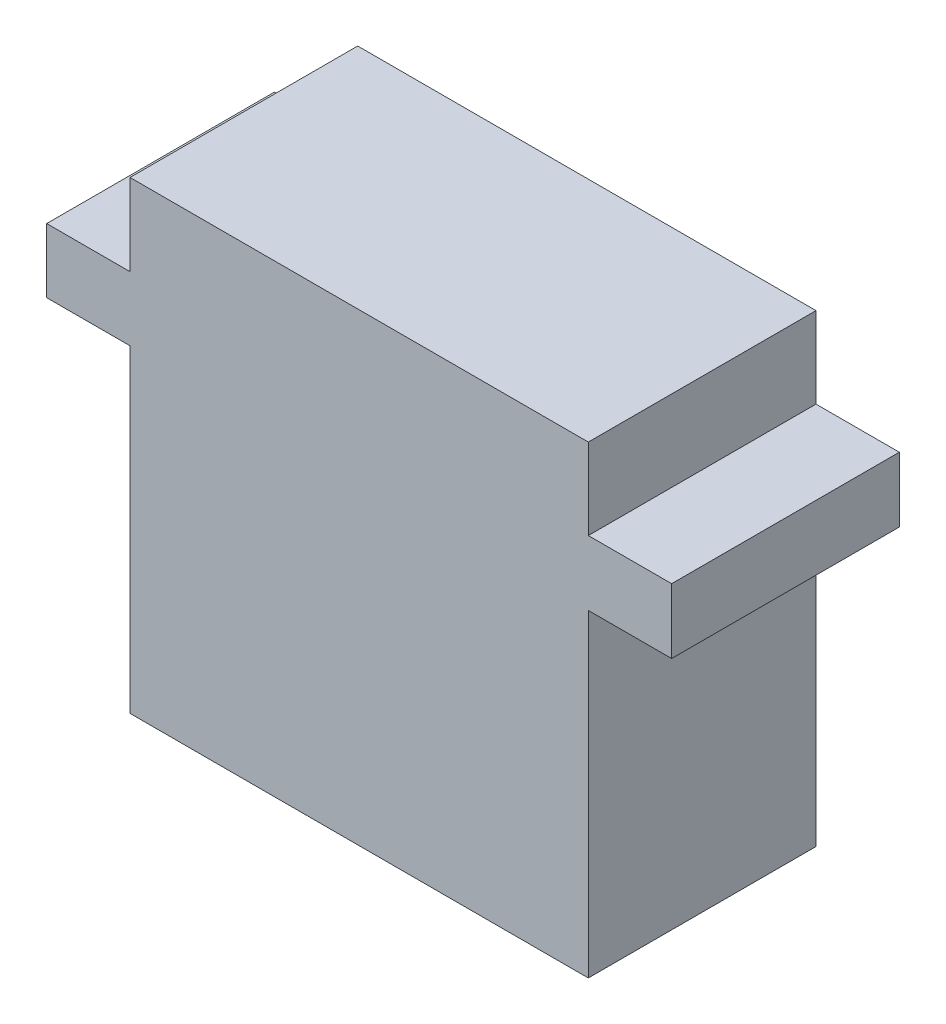
ISO-10303-21;
HEADER;
FILE_DESCRIPTION(('STEP AP214'),'2;1');
FILE_NAME('part.step','',(''),(''),'','','');
FILE_SCHEMA(('AUTOMOTIVE_DESIGN { 1 0 10303 214 1 1 1 1 }'));
ENDSEC;
DATA;
#1=APPLICATION_CONTEXT('core data for automotive mechanical design processes');
#2=APPLICATION_PROTOCOL_DEFINITION('international standard','automotive_design',2000,#1);
#3=PRODUCT_CONTEXT('',#1,'mechanical');
#4=PRODUCT('Part','Part','',(#3));
#5=PRODUCT_RELATED_PRODUCT_CATEGORY('part','',(#4));
#6=PRODUCT_DEFINITION_FORMATION('','',#4);
#7=PRODUCT_DEFINITION_CONTEXT('part definition',#1,'design');
#8=PRODUCT_DEFINITION('design','',#6,#7);
#9=PRODUCT_DEFINITION_SHAPE('','',#8);
#10=(LENGTH_UNIT() NAMED_UNIT(*) SI_UNIT(.MILLI.,.METRE.));
#11=(NAMED_UNIT(*) PLANE_ANGLE_UNIT() SI_UNIT($,.RADIAN.));
#12=(NAMED_UNIT(*) SI_UNIT($,.STERADIAN.) SOLID_ANGLE_UNIT());
#13=UNCERTAINTY_MEASURE_WITH_UNIT(LENGTH_MEASURE(1.E-05),#10,'distance_accuracy_value','');
#14=(GEOMETRIC_REPRESENTATION_CONTEXT(3) GLOBAL_UNCERTAINTY_ASSIGNED_CONTEXT((#13)) GLOBAL_UNIT_ASSIGNED_CONTEXT((#10,
#11,#12)) REPRESENTATION_CONTEXT('',''));
#15=CARTESIAN_POINT('',(0.,0.,0.));
#16=DIRECTION('',(0.,0.,1.));
#17=DIRECTION('',(1.,0.,0.));
#18=AXIS2_PLACEMENT_3D('',#15,#16,#17);
#19=CARTESIAN_POINT('',(0.,40.386,0.));
#20=DIRECTION('',(1.,0.,0.));
#21=DIRECTION('',(0.,0.,-1.));
#22=AXIS2_PLACEMENT_3D('',#19,#20,#21);
#23=PLANE('',#22);
#24=DIRECTION('',(0.,0.,-1.));
#25=VECTOR('',#24,1.);
#26=CARTESIAN_POINT('',(0.,33.288,-19.812));
#27=LINE('',#26,#25);
#28=CARTESIAN_POINT('',(0.,33.288,0.));
#29=VERTEX_POINT('',#28);
#30=CARTESIAN_POINT('',(0.,33.288,-19.812));
#31=VERTEX_POINT('',#30);
#32=EDGE_CURVE('E150',#29,#31,#27,.T.);
#33=ORIENTED_EDGE('',*,*,#32,.F.);
#34=DIRECTION('',(0.,-1.,0.));
#35=VECTOR('',#34,1.);
#36=CARTESIAN_POINT('',(0.,40.386,0.));
#37=LINE('',#36,#35);
#38=CARTESIAN_POINT('',(0.,40.386,0.));
#39=VERTEX_POINT('',#38);
#40=EDGE_CURVE('E11',#39,#29,#37,.T.);
#41=ORIENTED_EDGE('',*,*,#40,.F.);
#42=DIRECTION('',(0.,0.,1.));
#43=VECTOR('',#42,1.);
#44=CARTESIAN_POINT('',(0.,40.386,0.));
#45=LINE('',#44,#43);
#46=CARTESIAN_POINT('',(0.,40.386,-19.812));
#47=VERTEX_POINT('',#46);
#48=EDGE_CURVE('E200',#47,#39,#45,.T.);
#49=ORIENTED_EDGE('',*,*,#48,.F.);
#50=DIRECTION('',(0.,-1.,0.));
#51=VECTOR('',#50,1.);
#52=CARTESIAN_POINT('',(0.,40.386,-19.812));
#53=LINE('',#52,#51);
#54=EDGE_CURVE('E62',#47,#31,#53,.T.);
#55=ORIENTED_EDGE('',*,*,#54,.T.);
#56=EDGE_LOOP('',(#33,#41,#49,#55));
#57=FACE_BOUND('',#56,.T.);
#58=ADVANCED_FACE('F39',(#57),#23,.F.);
#59=DIRECTION('',(0.,0.,1.));
#60=VECTOR('',#59,1.);
#61=CARTESIAN_POINT('',(0.,27.7,-19.812));
#62=LINE('',#61,#60);
#63=CARTESIAN_POINT('',(0.,27.7,-19.812));
#64=VERTEX_POINT('',#63);
#65=CARTESIAN_POINT('',(0.,27.7,0.));
#66=VERTEX_POINT('',#65);
#67=EDGE_CURVE('E54',#64,#66,#62,.T.);
#68=ORIENTED_EDGE('',*,*,#67,.F.);
#69=CARTESIAN_POINT('',(0.,0.,-19.812));
#70=VERTEX_POINT('',#69);
#71=EDGE_CURVE('E154',#64,#70,#53,.T.);
#72=ORIENTED_EDGE('',*,*,#71,.T.);
#73=DIRECTION('',(0.,0.,1.));
#74=VECTOR('',#73,1.);
#75=CARTESIAN_POINT('',(0.,0.,0.));
#76=LINE('',#75,#74);
#77=CARTESIAN_POINT('',(0.,0.,0.));
#78=VERTEX_POINT('',#77);
#79=EDGE_CURVE('E199',#70,#78,#76,.T.);
#80=ORIENTED_EDGE('',*,*,#79,.T.);
#81=EDGE_CURVE('E47',#66,#78,#37,.T.);
#82=ORIENTED_EDGE('',*,*,#81,.F.);
#83=EDGE_LOOP('',(#68,#72,#80,#82));
#84=FACE_BOUND('',#83,.T.);
#85=ADVANCED_FACE('F257',(#84),#23,.F.);
#86=CARTESIAN_POINT('',(39.878,40.386,0.));
#87=DIRECTION('',(-1.,0.,0.));
#88=DIRECTION('',(0.,0.,1.));
#89=AXIS2_PLACEMENT_3D('',#86,#87,#88);
#90=PLANE('',#89);
#91=DIRECTION('',(0.,0.,1.));
#92=VECTOR('',#91,1.);
#93=CARTESIAN_POINT('',(39.878,33.340095975477,0.));
#94=LINE('',#93,#92);
#95=CARTESIAN_POINT('',(39.878,33.340095975477,-19.812));
#96=VERTEX_POINT('',#95);
#97=CARTESIAN_POINT('',(39.878,33.340095975477,0.));
#98=VERTEX_POINT('',#97);
#99=EDGE_CURVE('E161',#96,#98,#94,.T.);
#100=ORIENTED_EDGE('',*,*,#99,.F.);
#101=DIRECTION('',(0.,-1.,0.));
#102=VECTOR('',#101,1.);
#103=CARTESIAN_POINT('',(39.878,40.386,-19.812));
#104=LINE('',#103,#102);
#105=CARTESIAN_POINT('',(39.878,40.386,-19.812));
#106=VERTEX_POINT('',#105);
#107=EDGE_CURVE('E230',#106,#96,#104,.T.);
#108=ORIENTED_EDGE('',*,*,#107,.F.);
#109=DIRECTION('',(0.,0.,-1.));
#110=VECTOR('',#109,1.);
#111=CARTESIAN_POINT('',(39.878,40.386,0.));
#112=LINE('',#111,#110);
#113=CARTESIAN_POINT('',(39.878,40.386,0.));
#114=VERTEX_POINT('',#113);
#115=EDGE_CURVE('E208',#114,#106,#112,.T.);
#116=ORIENTED_EDGE('',*,*,#115,.F.);
#117=DIRECTION('',(0.,-1.,0.));
#118=VECTOR('',#117,1.);
#119=CARTESIAN_POINT('',(39.878,40.386,0.));
#120=LINE('',#119,#118);
#121=EDGE_CURVE('E234',#114,#98,#120,.T.);
#122=ORIENTED_EDGE('',*,*,#121,.T.);
#123=EDGE_LOOP('',(#100,#108,#116,#122));
#124=FACE_BOUND('',#123,.T.);
#125=ADVANCED_FACE('F279',(#124),#90,.F.);
#126=DIRECTION('',(0.,0.,-1.));
#127=VECTOR('',#126,1.);
#128=CARTESIAN_POINT('',(39.878,27.7,0.));
#129=LINE('',#128,#127);
#130=CARTESIAN_POINT('',(39.878,27.7,0.));
#131=VERTEX_POINT('',#130);
#132=CARTESIAN_POINT('',(39.878,27.7,-19.812));
#133=VERTEX_POINT('',#132);
#134=EDGE_CURVE('E156',#131,#133,#129,.T.);
#135=ORIENTED_EDGE('',*,*,#134,.F.);
#136=CARTESIAN_POINT('',(39.878,0.,0.));
#137=VERTEX_POINT('',#136);
#138=EDGE_CURVE('E233',#131,#137,#120,.T.);
#139=ORIENTED_EDGE('',*,*,#138,.T.);
#140=DIRECTION('',(0.,0.,-1.));
#141=VECTOR('',#140,1.);
#142=CARTESIAN_POINT('',(39.878,0.,0.));
#143=LINE('',#142,#141);
#144=CARTESIAN_POINT('',(39.878,0.,-19.812));
#145=VERTEX_POINT('',#144);
#146=EDGE_CURVE('E221',#137,#145,#143,.T.);
#147=ORIENTED_EDGE('',*,*,#146,.T.);
#148=EDGE_CURVE('E229',#133,#145,#104,.T.);
#149=ORIENTED_EDGE('',*,*,#148,.F.);
#150=EDGE_LOOP('',(#135,#139,#147,#149));
#151=FACE_BOUND('',#150,.T.);
#152=ADVANCED_FACE('F243',(#151),#90,.F.);
#153=CARTESIAN_POINT('',(0.,40.386,0.));
#154=DIRECTION('',(0.,0.,-1.));
#155=DIRECTION('',(-1.,0.,0.));
#156=AXIS2_PLACEMENT_3D('',#153,#154,#155);
#157=PLANE('',#156);
#158=DIRECTION('',(1.,0.,0.));
#159=VECTOR('',#158,1.);
#160=CARTESIAN_POINT('',(0.,0.,0.));
#161=LINE('',#160,#159);
#162=EDGE_CURVE('E217',#78,#137,#161,.T.);
#163=ORIENTED_EDGE('',*,*,#162,.T.);
#164=ORIENTED_EDGE('',*,*,#138,.F.);
#165=DIRECTION('',(-1.,0.,0.));
#166=VECTOR('',#165,1.);
#167=CARTESIAN_POINT('',(47.128,27.7,0.));
#168=LINE('',#167,#166);
#169=CARTESIAN_POINT('',(47.128,27.7,0.));
#170=VERTEX_POINT('',#169);
#171=EDGE_CURVE('E195',#170,#131,#168,.T.);
#172=ORIENTED_EDGE('',*,*,#171,.F.);
#173=DIRECTION('',(0.,-1.,0.));
#174=VECTOR('',#173,1.);
#175=CARTESIAN_POINT('',(47.128,27.7,0.));
#176=LINE('',#175,#174);
#177=CARTESIAN_POINT('',(47.128,33.340095975477,0.));
#178=VERTEX_POINT('',#177);
#179=EDGE_CURVE('E167',#178,#170,#176,.T.);
#180=ORIENTED_EDGE('',*,*,#179,.F.);
#181=DIRECTION('',(-1.,0.,0.));
#182=VECTOR('',#181,1.);
#183=CARTESIAN_POINT('',(47.128,33.340095975477,0.));
#184=LINE('',#183,#182);
#185=EDGE_CURVE('E179',#178,#98,#184,.T.);
#186=ORIENTED_EDGE('',*,*,#185,.T.);
#187=ORIENTED_EDGE('',*,*,#121,.F.);
#188=DIRECTION('',(1.,0.,0.));
#189=VECTOR('',#188,1.);
#190=CARTESIAN_POINT('',(0.,40.386,0.));
#191=LINE('',#190,#189);
#192=EDGE_CURVE('E204',#39,#114,#191,.T.);
#193=ORIENTED_EDGE('',*,*,#192,.F.);
#194=ORIENTED_EDGE('',*,*,#40,.T.);
#195=DIRECTION('',(1.,0.,0.));
#196=VECTOR('',#195,1.);
#197=CARTESIAN_POINT('',(-7.25,33.288,0.));
#198=LINE('',#197,#196);
#199=CARTESIAN_POINT('',(-7.25,33.288,0.));
#200=VERTEX_POINT('',#199);
#201=EDGE_CURVE('E163',#200,#29,#198,.T.);
#202=ORIENTED_EDGE('',*,*,#201,.F.);
#203=DIRECTION('',(0.,1.,0.));
#204=VECTOR('',#203,1.);
#205=CARTESIAN_POINT('',(-7.25,27.7,0.));
#206=LINE('',#205,#204);
#207=CARTESIAN_POINT('',(-7.25,27.7,0.));
#208=VERTEX_POINT('',#207);
#209=EDGE_CURVE('E139',#208,#200,#206,.T.);
#210=ORIENTED_EDGE('',*,*,#209,.F.);
#211=DIRECTION('',(1.,0.,0.));
#212=VECTOR('',#211,1.);
#213=CARTESIAN_POINT('',(-7.25,27.7,0.));
#214=LINE('',#213,#212);
#215=EDGE_CURVE('E135',#208,#66,#214,.T.);
#216=ORIENTED_EDGE('',*,*,#215,.T.);
#217=ORIENTED_EDGE('',*,*,#81,.T.);
#218=EDGE_LOOP('',(#163,#164,#172,#180,#186,#187,#193,#194,#202,#210,#216,#217));
#219=FACE_BOUND('',#218,.T.);
#220=ADVANCED_FACE('F249',(#219),#157,.F.);
#221=CARTESIAN_POINT('',(0.,40.386,-19.812));
#222=DIRECTION('',(0.,0.,1.));
#223=DIRECTION('',(1.,0.,0.));
#224=AXIS2_PLACEMENT_3D('',#221,#222,#223);
#225=PLANE('',#224);
#226=DIRECTION('',(-1.,0.,0.));
#227=VECTOR('',#226,1.);
#228=CARTESIAN_POINT('',(0.,0.,-19.812));
#229=LINE('',#228,#227);
#230=EDGE_CURVE('E205',#145,#70,#229,.T.);
#231=ORIENTED_EDGE('',*,*,#230,.T.);
#232=ORIENTED_EDGE('',*,*,#71,.F.);
#233=DIRECTION('',(1.,0.,0.));
#234=VECTOR('',#233,1.);
#235=CARTESIAN_POINT('',(-7.25,27.7,-19.812));
#236=LINE('',#235,#234);
#237=CARTESIAN_POINT('',(-7.25,27.7,-19.812));
#238=VERTEX_POINT('',#237);
#239=EDGE_CURVE('E133',#238,#64,#236,.T.);
#240=ORIENTED_EDGE('',*,*,#239,.F.);
#241=DIRECTION('',(0.,-1.,0.));
#242=VECTOR('',#241,1.);
#243=CARTESIAN_POINT('',(-7.25,27.7,-19.812));
#244=LINE('',#243,#242);
#245=CARTESIAN_POINT('',(-7.25,33.288,-19.812));
#246=VERTEX_POINT('',#245);
#247=EDGE_CURVE('E140',#246,#238,#244,.T.);
#248=ORIENTED_EDGE('',*,*,#247,.F.);
#249=DIRECTION('',(1.,0.,0.));
#250=VECTOR('',#249,1.);
#251=CARTESIAN_POINT('',(-7.25,33.288,-19.812));
#252=LINE('',#251,#250);
#253=EDGE_CURVE('E265',#246,#31,#252,.T.);
#254=ORIENTED_EDGE('',*,*,#253,.T.);
#255=ORIENTED_EDGE('',*,*,#54,.F.);
#256=DIRECTION('',(-1.,0.,0.));
#257=VECTOR('',#256,1.);
#258=CARTESIAN_POINT('',(0.,40.386,-19.812));
#259=LINE('',#258,#257);
#260=EDGE_CURVE('E211',#106,#47,#259,.T.);
#261=ORIENTED_EDGE('',*,*,#260,.F.);
#262=ORIENTED_EDGE('',*,*,#107,.T.);
#263=DIRECTION('',(-1.,0.,0.));
#264=VECTOR('',#263,1.);
#265=CARTESIAN_POINT('',(47.128,33.340095975477,-19.812));
#266=LINE('',#265,#264);
#267=CARTESIAN_POINT('',(47.128,33.340095975477,-19.812));
#268=VERTEX_POINT('',#267);
#269=EDGE_CURVE('E187',#268,#96,#266,.T.);
#270=ORIENTED_EDGE('',*,*,#269,.F.);
#271=DIRECTION('',(0.,1.,0.));
#272=VECTOR('',#271,1.);
#273=CARTESIAN_POINT('',(47.128,27.7,-19.812));
#274=LINE('',#273,#272);
#275=CARTESIAN_POINT('',(47.128,27.7,-19.812));
#276=VERTEX_POINT('',#275);
#277=EDGE_CURVE('E174',#276,#268,#274,.T.);
#278=ORIENTED_EDGE('',*,*,#277,.F.);
#279=DIRECTION('',(-1.,0.,0.));
#280=VECTOR('',#279,1.);
#281=CARTESIAN_POINT('',(47.128,27.7,-19.812));
#282=LINE('',#281,#280);
#283=EDGE_CURVE('E191',#276,#133,#282,.T.);
#284=ORIENTED_EDGE('',*,*,#283,.T.);
#285=ORIENTED_EDGE('',*,*,#148,.T.);
#286=EDGE_LOOP('',(#231,#232,#240,#248,#254,#255,#261,#262,#270,#278,#284,#285));
#287=FACE_BOUND('',#286,.T.);
#288=ADVANCED_FACE('F153',(#287),#225,.F.);
#289=CARTESIAN_POINT('',(0.,40.386,0.));
#290=DIRECTION('',(0.,-1.,0.));
#291=DIRECTION('',(0.,0.,-1.));
#292=AXIS2_PLACEMENT_3D('',#289,#290,#291);
#293=PLANE('',#292);
#294=ORIENTED_EDGE('',*,*,#48,.T.);
#295=ORIENTED_EDGE('',*,*,#192,.T.);
#296=ORIENTED_EDGE('',*,*,#115,.T.);
#297=ORIENTED_EDGE('',*,*,#260,.T.);
#298=EDGE_LOOP('',(#294,#295,#296,#297));
#299=FACE_BOUND('',#298,.T.);
#300=ADVANCED_FACE('F277',(#299),#293,.F.);
#301=CARTESIAN_POINT('',(0.,0.,0.));
#302=DIRECTION('',(0.,-1.,0.));
#303=DIRECTION('',(0.,0.,-1.));
#304=AXIS2_PLACEMENT_3D('',#301,#302,#303);
#305=PLANE('',#304);
#306=ORIENTED_EDGE('',*,*,#79,.F.);
#307=ORIENTED_EDGE('',*,*,#230,.F.);
#308=ORIENTED_EDGE('',*,*,#146,.F.);
#309=ORIENTED_EDGE('',*,*,#162,.F.);
#310=EDGE_LOOP('',(#306,#307,#308,#309));
#311=FACE_BOUND('',#310,.T.);
#312=ADVANCED_FACE('F252',(#311),#305,.T.);
#313=CARTESIAN_POINT('',(47.128,27.7,0.));
#314=DIRECTION('',(0.,1.,0.));
#315=DIRECTION('',(0.,0.,1.));
#316=AXIS2_PLACEMENT_3D('',#313,#314,#315);
#317=PLANE('',#316);
#318=ORIENTED_EDGE('',*,*,#134,.T.);
#319=ORIENTED_EDGE('',*,*,#283,.F.);
#320=DIRECTION('',(0.,0.,-1.));
#321=VECTOR('',#320,1.);
#322=CARTESIAN_POINT('',(47.128,27.7,0.));
#323=LINE('',#322,#321);
#324=EDGE_CURVE('E171',#170,#276,#323,.T.);
#325=ORIENTED_EDGE('',*,*,#324,.F.);
#326=ORIENTED_EDGE('',*,*,#171,.T.);
#327=EDGE_LOOP('',(#318,#319,#325,#326));
#328=FACE_BOUND('',#327,.T.);
#329=ADVANCED_FACE('F289',(#328),#317,.F.);
#330=CARTESIAN_POINT('',(47.128,33.340095975477,0.));
#331=DIRECTION('',(0.,-1.,0.));
#332=DIRECTION('',(0.,0.,-1.));
#333=AXIS2_PLACEMENT_3D('',#330,#331,#332);
#334=PLANE('',#333);
#335=ORIENTED_EDGE('',*,*,#99,.T.);
#336=ORIENTED_EDGE('',*,*,#185,.F.);
#337=DIRECTION('',(0.,0.,1.));
#338=VECTOR('',#337,1.);
#339=CARTESIAN_POINT('',(47.128,33.340095975477,0.));
#340=LINE('',#339,#338);
#341=EDGE_CURVE('E177',#268,#178,#340,.T.);
#342=ORIENTED_EDGE('',*,*,#341,.F.);
#343=ORIENTED_EDGE('',*,*,#269,.T.);
#344=EDGE_LOOP('',(#335,#336,#342,#343));
#345=FACE_BOUND('',#344,.T.);
#346=ADVANCED_FACE('F283',(#345),#334,.F.);
#347=CARTESIAN_POINT('',(47.128,0.,0.));
#348=DIRECTION('',(-1.,0.,0.));
#349=DIRECTION('',(0.,0.,1.));
#350=AXIS2_PLACEMENT_3D('',#347,#348,#349);
#351=PLANE('',#350);
#352=ORIENTED_EDGE('',*,*,#179,.T.);
#353=ORIENTED_EDGE('',*,*,#324,.T.);
#354=ORIENTED_EDGE('',*,*,#277,.T.);
#355=ORIENTED_EDGE('',*,*,#341,.T.);
#356=EDGE_LOOP('',(#352,#353,#354,#355));
#357=FACE_BOUND('',#356,.T.);
#358=ADVANCED_FACE('F287',(#357),#351,.F.);
#359=CARTESIAN_POINT('',(-7.25,27.7,-19.812));
#360=DIRECTION('',(0.,1.,0.));
#361=DIRECTION('',(0.,0.,1.));
#362=AXIS2_PLACEMENT_3D('',#359,#360,#361);
#363=PLANE('',#362);
#364=ORIENTED_EDGE('',*,*,#67,.T.);
#365=ORIENTED_EDGE('',*,*,#215,.F.);
#366=DIRECTION('',(0.,0.,1.));
#367=VECTOR('',#366,1.);
#368=CARTESIAN_POINT('',(-7.25,27.7,-19.812));
#369=LINE('',#368,#367);
#370=EDGE_CURVE('E129',#238,#208,#369,.T.);
#371=ORIENTED_EDGE('',*,*,#370,.F.);
#372=ORIENTED_EDGE('',*,*,#239,.T.);
#373=EDGE_LOOP('',(#364,#365,#371,#372));
#374=FACE_BOUND('',#373,.T.);
#375=ADVANCED_FACE('F131',(#374),#363,.F.);
#376=CARTESIAN_POINT('',(-7.25,33.288,-19.812));
#377=DIRECTION('',(0.,-1.,0.));
#378=DIRECTION('',(0.,0.,-1.));
#379=AXIS2_PLACEMENT_3D('',#376,#377,#378);
#380=PLANE('',#379);
#381=ORIENTED_EDGE('',*,*,#32,.T.);
#382=ORIENTED_EDGE('',*,*,#253,.F.);
#383=DIRECTION('',(0.,0.,-1.));
#384=VECTOR('',#383,1.);
#385=CARTESIAN_POINT('',(-7.25,33.288,-19.812));
#386=LINE('',#385,#384);
#387=EDGE_CURVE('E145',#200,#246,#386,.T.);
#388=ORIENTED_EDGE('',*,*,#387,.F.);
#389=ORIENTED_EDGE('',*,*,#201,.T.);
#390=EDGE_LOOP('',(#381,#382,#388,#389));
#391=FACE_BOUND('',#390,.T.);
#392=ADVANCED_FACE('F273',(#391),#380,.F.);
#393=CARTESIAN_POINT('',(-7.25,0.,0.));
#394=DIRECTION('',(1.,0.,0.));
#395=DIRECTION('',(0.,0.,-1.));
#396=AXIS2_PLACEMENT_3D('',#393,#394,#395);
#397=PLANE('',#396);
#398=ORIENTED_EDGE('',*,*,#247,.T.);
#399=ORIENTED_EDGE('',*,*,#370,.T.);
#400=ORIENTED_EDGE('',*,*,#209,.T.);
#401=ORIENTED_EDGE('',*,*,#387,.T.);
#402=EDGE_LOOP('',(#398,#399,#400,#401));
#403=FACE_BOUND('',#402,.T.);
#404=ADVANCED_FACE('F143',(#403),#397,.F.);
#405=CLOSED_SHELL('',(#58,#85,#125,#152,#220,#288,#300,#312,#329,#346,#358,#375,#392,#404));
#406=MANIFOLD_SOLID_BREP('B2',#405);
#407=ADVANCED_BREP_SHAPE_REPRESENTATION('',(#18,#406),#14);
#408=SHAPE_DEFINITION_REPRESENTATION(#9,#407);
ENDSEC;
END-ISO-10303-21;
